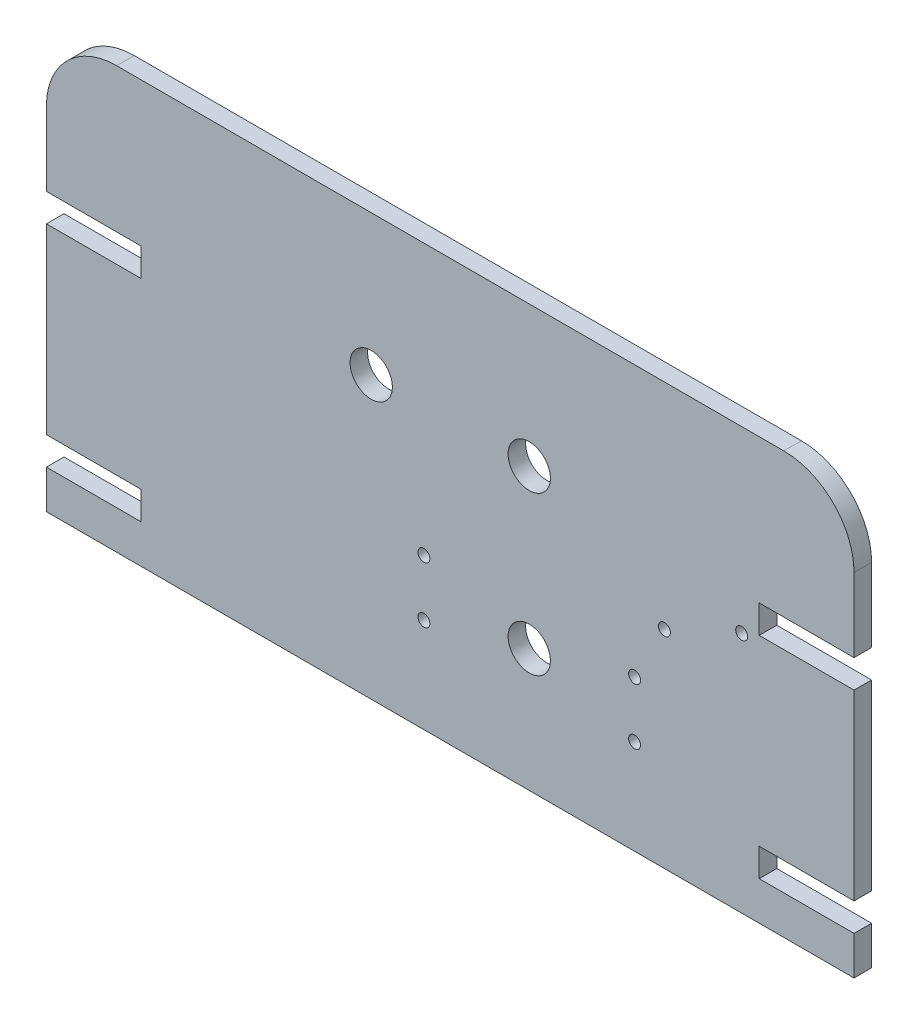
ISO-10303-21;
HEADER;
FILE_DESCRIPTION(('STEP AP214'),'2;1');
FILE_NAME('part.step','',(''),(''),'','','');
FILE_SCHEMA(('AUTOMOTIVE_DESIGN { 1 0 10303 214 1 1 1 1 }'));
ENDSEC;
DATA;
#1=APPLICATION_CONTEXT('core data for automotive mechanical design processes');
#2=APPLICATION_PROTOCOL_DEFINITION('international standard','automotive_design',2000,#1);
#3=PRODUCT_CONTEXT('',#1,'mechanical');
#4=PRODUCT('Part','Part','',(#3));
#5=PRODUCT_RELATED_PRODUCT_CATEGORY('part','',(#4));
#6=PRODUCT_DEFINITION_FORMATION('','',#4);
#7=PRODUCT_DEFINITION_CONTEXT('part definition',#1,'design');
#8=PRODUCT_DEFINITION('design','',#6,#7);
#9=PRODUCT_DEFINITION_SHAPE('','',#8);
#10=(LENGTH_UNIT() NAMED_UNIT(*) SI_UNIT(.MILLI.,.METRE.));
#11=(NAMED_UNIT(*) PLANE_ANGLE_UNIT() SI_UNIT($,.RADIAN.));
#12=(NAMED_UNIT(*) SI_UNIT($,.STERADIAN.) SOLID_ANGLE_UNIT());
#13=UNCERTAINTY_MEASURE_WITH_UNIT(LENGTH_MEASURE(1.E-05),#10,'distance_accuracy_value','');
#14=(GEOMETRIC_REPRESENTATION_CONTEXT(3) GLOBAL_UNCERTAINTY_ASSIGNED_CONTEXT((#13)) GLOBAL_UNIT_ASSIGNED_CONTEXT((#10,
#11,#12)) REPRESENTATION_CONTEXT('',''));
#15=CARTESIAN_POINT('',(0.,0.,0.));
#16=DIRECTION('',(0.,0.,1.));
#17=DIRECTION('',(1.,0.,0.));
#18=AXIS2_PLACEMENT_3D('',#15,#16,#17);
#19=CARTESIAN_POINT('',(115.,-60.,5.));
#20=DIRECTION('',(-1.,0.,0.));
#21=DIRECTION('',(0.,0.,1.));
#22=AXIS2_PLACEMENT_3D('',#19,#20,#21);
#23=PLANE('',#22);
#24=DIRECTION('',(0.,1.,0.));
#25=VECTOR('',#24,1.);
#26=CARTESIAN_POINT('',(115.,-60.,0.));
#27=LINE('',#26,#25);
#28=CARTESIAN_POINT('',(115.,19.0000000007499,0.));
#29=VERTEX_POINT('',#28);
#30=CARTESIAN_POINT('',(115.,40.,0.));
#31=VERTEX_POINT('',#30);
#32=EDGE_CURVE('E240',#29,#31,#27,.T.);
#33=ORIENTED_EDGE('',*,*,#32,.T.);
#34=DIRECTION('',(0.,0.,-1.));
#35=VECTOR('',#34,1.);
#36=CARTESIAN_POINT('',(115.,40.,5.));
#37=LINE('',#36,#35);
#38=CARTESIAN_POINT('',(115.,40.,5.));
#39=VERTEX_POINT('',#38);
#40=EDGE_CURVE('E62',#31,#39,#37,.F.);
#41=ORIENTED_EDGE('',*,*,#40,.T.);
#42=DIRECTION('',(0.,1.,0.));
#43=VECTOR('',#42,1.);
#44=CARTESIAN_POINT('',(115.,-60.,5.));
#45=LINE('',#44,#43);
#46=CARTESIAN_POINT('',(115.,19.0000000007499,5.));
#47=VERTEX_POINT('',#46);
#48=EDGE_CURVE('E251',#47,#39,#45,.T.);
#49=ORIENTED_EDGE('',*,*,#48,.F.);
#50=DIRECTION('',(0.,0.,-1.));
#51=VECTOR('',#50,1.);
#52=CARTESIAN_POINT('',(115.,19.0000000007499,5.001));
#53=LINE('',#52,#51);
#54=EDGE_CURVE('E293',#47,#29,#53,.T.);
#55=ORIENTED_EDGE('',*,*,#54,.T.);
#56=EDGE_LOOP('',(#33,#41,#49,#55));
#57=FACE_BOUND('',#56,.T.);
#58=ADVANCED_FACE('F38',(#57),#23,.F.);
#59=CARTESIAN_POINT('',(115.,-40.9999999999375,0.));
#60=VERTEX_POINT('',#59);
#61=CARTESIAN_POINT('',(115.,11.0000000000625,0.));
#62=VERTEX_POINT('',#61);
#63=EDGE_CURVE('E239',#60,#62,#27,.T.);
#64=ORIENTED_EDGE('',*,*,#63,.T.);
#65=DIRECTION('',(0.,0.,-1.));
#66=VECTOR('',#65,1.);
#67=CARTESIAN_POINT('',(115.,11.0000000000625,5.001));
#68=LINE('',#67,#66);
#69=CARTESIAN_POINT('',(115.,11.0000000000625,5.));
#70=VERTEX_POINT('',#69);
#71=EDGE_CURVE('E387',#70,#62,#68,.T.);
#72=ORIENTED_EDGE('',*,*,#71,.F.);
#73=CARTESIAN_POINT('',(115.,-40.9999999999375,5.));
#74=VERTEX_POINT('',#73);
#75=EDGE_CURVE('E314',#74,#70,#45,.T.);
#76=ORIENTED_EDGE('',*,*,#75,.F.);
#77=DIRECTION('',(0.,0.,-1.));
#78=VECTOR('',#77,1.);
#79=CARTESIAN_POINT('',(115.,-40.9999999999375,5.001));
#80=LINE('',#79,#78);
#81=EDGE_CURVE('E346',#74,#60,#80,.T.);
#82=ORIENTED_EDGE('',*,*,#81,.T.);
#83=EDGE_LOOP('',(#64,#72,#76,#82));
#84=FACE_BOUND('',#83,.T.);
#85=ADVANCED_FACE('F436',(#84),#23,.F.);
#86=CARTESIAN_POINT('',(-115.,-60.,5.));
#87=DIRECTION('',(1.,0.,0.));
#88=DIRECTION('',(0.,0.,-1.));
#89=AXIS2_PLACEMENT_3D('',#86,#87,#88);
#90=PLANE('',#89);
#91=DIRECTION('',(0.,-1.,0.));
#92=VECTOR('',#91,1.);
#93=CARTESIAN_POINT('',(-115.,-60.,5.));
#94=LINE('',#93,#92);
#95=CARTESIAN_POINT('',(-115.,-49.000000000625,5.));
#96=VERTEX_POINT('',#95);
#97=CARTESIAN_POINT('',(-115.,-60.,5.));
#98=VERTEX_POINT('',#97);
#99=EDGE_CURVE('E222',#96,#98,#94,.T.);
#100=ORIENTED_EDGE('',*,*,#99,.F.);
#101=DIRECTION('',(0.,0.,-1.));
#102=VECTOR('',#101,1.);
#103=CARTESIAN_POINT('',(-115.,-49.000000000625,5.001));
#104=LINE('',#103,#102);
#105=CARTESIAN_POINT('',(-115.,-49.000000000625,0.));
#106=VERTEX_POINT('',#105);
#107=EDGE_CURVE('E202',#96,#106,#104,.T.);
#108=ORIENTED_EDGE('',*,*,#107,.T.);
#109=DIRECTION('',(0.,-1.,0.));
#110=VECTOR('',#109,1.);
#111=CARTESIAN_POINT('',(-115.,-60.,0.));
#112=LINE('',#111,#110);
#113=CARTESIAN_POINT('',(-115.,-60.,0.));
#114=VERTEX_POINT('',#113);
#115=EDGE_CURVE('E244',#106,#114,#112,.T.);
#116=ORIENTED_EDGE('',*,*,#115,.T.);
#117=DIRECTION('',(0.,0.,-1.));
#118=VECTOR('',#117,1.);
#119=CARTESIAN_POINT('',(-115.,-60.,5.));
#120=LINE('',#119,#118);
#121=EDGE_CURVE('E255',#98,#114,#120,.T.);
#122=ORIENTED_EDGE('',*,*,#121,.F.);
#123=EDGE_LOOP('',(#100,#108,#116,#122));
#124=FACE_BOUND('',#123,.T.);
#125=ADVANCED_FACE('F327',(#124),#90,.F.);
#126=CARTESIAN_POINT('',(-115.,11.0000000000625,0.));
#127=VERTEX_POINT('',#126);
#128=CARTESIAN_POINT('',(-115.,-40.9999999999375,0.));
#129=VERTEX_POINT('',#128);
#130=EDGE_CURVE('E211',#127,#129,#112,.T.);
#131=ORIENTED_EDGE('',*,*,#130,.T.);
#132=DIRECTION('',(0.,0.,-1.));
#133=VECTOR('',#132,1.);
#134=CARTESIAN_POINT('',(-115.,-40.9999999999375,5.001));
#135=LINE('',#134,#133);
#136=CARTESIAN_POINT('',(-115.,-40.9999999999375,5.));
#137=VERTEX_POINT('',#136);
#138=EDGE_CURVE('E194',#137,#129,#135,.T.);
#139=ORIENTED_EDGE('',*,*,#138,.F.);
#140=CARTESIAN_POINT('',(-115.,11.0000000000625,5.));
#141=VERTEX_POINT('',#140);
#142=EDGE_CURVE('E209',#141,#137,#94,.T.);
#143=ORIENTED_EDGE('',*,*,#142,.F.);
#144=DIRECTION('',(0.,0.,-1.));
#145=VECTOR('',#144,1.);
#146=CARTESIAN_POINT('',(-115.,11.0000000000625,5.001));
#147=LINE('',#146,#145);
#148=EDGE_CURVE('E300',#141,#127,#147,.T.);
#149=ORIENTED_EDGE('',*,*,#148,.T.);
#150=EDGE_LOOP('',(#131,#139,#143,#149));
#151=FACE_BOUND('',#150,.T.);
#152=ADVANCED_FACE('F207',(#151),#90,.F.);
#153=CARTESIAN_POINT('',(115.,-60.,0.));
#154=VERTEX_POINT('',#153);
#155=CARTESIAN_POINT('',(115.,-49.000000000625,0.));
#156=VERTEX_POINT('',#155);
#157=EDGE_CURVE('E234',#154,#156,#27,.T.);
#158=ORIENTED_EDGE('',*,*,#157,.T.);
#159=DIRECTION('',(0.,0.,-1.));
#160=VECTOR('',#159,1.);
#161=CARTESIAN_POINT('',(115.,-49.000000000625,5.001));
#162=LINE('',#161,#160);
#163=CARTESIAN_POINT('',(115.,-49.000000000625,5.));
#164=VERTEX_POINT('',#163);
#165=EDGE_CURVE('E342',#164,#156,#162,.T.);
#166=ORIENTED_EDGE('',*,*,#165,.F.);
#167=CARTESIAN_POINT('',(115.,-60.,5.));
#168=VERTEX_POINT('',#167);
#169=EDGE_CURVE('E286',#168,#164,#45,.T.);
#170=ORIENTED_EDGE('',*,*,#169,.F.);
#171=DIRECTION('',(0.,0.,-1.));
#172=VECTOR('',#171,1.);
#173=CARTESIAN_POINT('',(115.,-60.,5.));
#174=LINE('',#173,#172);
#175=EDGE_CURVE('E233',#168,#154,#174,.T.);
#176=ORIENTED_EDGE('',*,*,#175,.T.);
#177=EDGE_LOOP('',(#158,#166,#170,#176));
#178=FACE_BOUND('',#177,.T.);
#179=ADVANCED_FACE('F341',(#178),#23,.F.);
#180=CARTESIAN_POINT('',(-115.,60.,5.));
#181=DIRECTION('',(0.,-1.,0.));
#182=DIRECTION('',(0.,0.,-1.));
#183=AXIS2_PLACEMENT_3D('',#180,#181,#182);
#184=PLANE('',#183);
#185=DIRECTION('',(-1.,0.,0.));
#186=VECTOR('',#185,1.);
#187=CARTESIAN_POINT('',(-115.,60.,5.));
#188=LINE('',#187,#186);
#189=CARTESIAN_POINT('',(95.,60.,5.));
#190=VERTEX_POINT('',#189);
#191=CARTESIAN_POINT('',(-95.,60.,5.));
#192=VERTEX_POINT('',#191);
#193=EDGE_CURVE('E227',#190,#192,#188,.T.);
#194=ORIENTED_EDGE('',*,*,#193,.F.);
#195=DIRECTION('',(0.,0.,-1.));
#196=VECTOR('',#195,1.);
#197=CARTESIAN_POINT('',(95.,60.,5.));
#198=LINE('',#197,#196);
#199=CARTESIAN_POINT('',(95.,60.,0.));
#200=VERTEX_POINT('',#199);
#201=EDGE_CURVE('E262',#190,#200,#198,.T.);
#202=ORIENTED_EDGE('',*,*,#201,.T.);
#203=DIRECTION('',(-1.,0.,0.));
#204=VECTOR('',#203,1.);
#205=CARTESIAN_POINT('',(-115.,60.,0.));
#206=LINE('',#205,#204);
#207=CARTESIAN_POINT('',(-95.,60.,0.));
#208=VERTEX_POINT('',#207);
#209=EDGE_CURVE('E238',#200,#208,#206,.T.);
#210=ORIENTED_EDGE('',*,*,#209,.T.);
#211=DIRECTION('',(0.,0.,-1.));
#212=VECTOR('',#211,1.);
#213=CARTESIAN_POINT('',(-95.,60.,5.));
#214=LINE('',#213,#212);
#215=EDGE_CURVE('E259',#208,#192,#214,.F.);
#216=ORIENTED_EDGE('',*,*,#215,.T.);
#217=EDGE_LOOP('',(#194,#202,#210,#216));
#218=FACE_BOUND('',#217,.T.);
#219=ADVANCED_FACE('F282',(#218),#184,.F.);
#220=CARTESIAN_POINT('',(-115.,40.,5.));
#221=VERTEX_POINT('',#220);
#222=CARTESIAN_POINT('',(-115.,19.0000000007499,5.));
#223=VERTEX_POINT('',#222);
#224=EDGE_CURVE('E221',#221,#223,#94,.T.);
#225=ORIENTED_EDGE('',*,*,#224,.F.);
#226=DIRECTION('',(0.,0.,-1.));
#227=VECTOR('',#226,1.);
#228=CARTESIAN_POINT('',(-115.,40.,5.));
#229=LINE('',#228,#227);
#230=CARTESIAN_POINT('',(-115.,40.,0.));
#231=VERTEX_POINT('',#230);
#232=EDGE_CURVE('E11',#221,#231,#229,.T.);
#233=ORIENTED_EDGE('',*,*,#232,.T.);
#234=CARTESIAN_POINT('',(-115.,19.0000000007499,0.));
#235=VERTEX_POINT('',#234);
#236=EDGE_CURVE('E245',#231,#235,#112,.T.);
#237=ORIENTED_EDGE('',*,*,#236,.T.);
#238=DIRECTION('',(0.,0.,-1.));
#239=VECTOR('',#238,1.);
#240=CARTESIAN_POINT('',(-115.,19.0000000007499,5.001));
#241=LINE('',#240,#239);
#242=EDGE_CURVE('E310',#223,#235,#241,.T.);
#243=ORIENTED_EDGE('',*,*,#242,.F.);
#244=EDGE_LOOP('',(#225,#233,#237,#243));
#245=FACE_BOUND('',#244,.T.);
#246=ADVANCED_FACE('F423',(#245),#90,.F.);
#247=CARTESIAN_POINT('',(-115.,-60.,5.));
#248=DIRECTION('',(0.,1.,0.));
#249=DIRECTION('',(0.,0.,1.));
#250=AXIS2_PLACEMENT_3D('',#247,#248,#249);
#251=PLANE('',#250);
#252=DIRECTION('',(1.,0.,0.));
#253=VECTOR('',#252,1.);
#254=CARTESIAN_POINT('',(-115.,-60.,0.));
#255=LINE('',#254,#253);
#256=EDGE_CURVE('E248',#114,#154,#255,.T.);
#257=ORIENTED_EDGE('',*,*,#256,.T.);
#258=ORIENTED_EDGE('',*,*,#175,.F.);
#259=DIRECTION('',(1.,0.,0.));
#260=VECTOR('',#259,1.);
#261=CARTESIAN_POINT('',(-115.,-60.,5.));
#262=LINE('',#261,#260);
#263=EDGE_CURVE('E226',#98,#168,#262,.T.);
#264=ORIENTED_EDGE('',*,*,#263,.F.);
#265=ORIENTED_EDGE('',*,*,#121,.T.);
#266=EDGE_LOOP('',(#257,#258,#264,#265));
#267=FACE_BOUND('',#266,.T.);
#268=ADVANCED_FACE('F332',(#267),#251,.F.);
#269=CARTESIAN_POINT('',(0.,0.,5.));
#270=DIRECTION('',(0.,0.,-1.));
#271=DIRECTION('',(-1.,0.,0.));
#272=AXIS2_PLACEMENT_3D('',#269,#270,#271);
#273=PLANE('',#272);
#274=CARTESIAN_POINT('',(61.,-0.999999999937542,5.));
#275=DIRECTION('',(0.,0.,1.));
#276=DIRECTION('',(1.,0.,0.));
#277=AXIS2_PLACEMENT_3D('',#274,#275,#276);
#278=CIRCLE('',#277,1.7);
#279=CARTESIAN_POINT('',(62.7,-0.999999999937542,5.));
#280=VERTEX_POINT('',#279);
#281=EDGE_CURVE('E546',#280,#280,#278,.T.);
#282=ORIENTED_EDGE('',*,*,#281,.F.);
#283=EDGE_LOOP('',(#282));
#284=FACE_BOUND('',#283,.T.);
#285=CARTESIAN_POINT('',(83.,9.00000000006245,5.));
#286=DIRECTION('',(0.,0.,1.));
#287=DIRECTION('',(1.,0.,0.));
#288=AXIS2_PLACEMENT_3D('',#285,#286,#287);
#289=CIRCLE('',#288,1.7);
#290=CARTESIAN_POINT('',(84.7,9.00000000006245,5.));
#291=VERTEX_POINT('',#290);
#292=EDGE_CURVE('E555',#291,#291,#289,.T.);
#293=ORIENTED_EDGE('',*,*,#292,.F.);
#294=EDGE_LOOP('',(#293));
#295=FACE_BOUND('',#294,.T.);
#296=CARTESIAN_POINT('',(-7.49999999999999,-17.,5.));
#297=DIRECTION('',(0.,0.,1.));
#298=DIRECTION('',(1.,0.,0.));
#299=AXIS2_PLACEMENT_3D('',#296,#297,#298);
#300=CIRCLE('',#299,1.69999999999999);
#301=CARTESIAN_POINT('',(-5.80000000000001,-17.,5.));
#302=VERTEX_POINT('',#301);
#303=EDGE_CURVE('E548',#302,#302,#300,.T.);
#304=ORIENTED_EDGE('',*,*,#303,.F.);
#305=EDGE_LOOP('',(#304));
#306=FACE_BOUND('',#305,.T.);
#307=CARTESIAN_POINT('',(52.5,-17.,5.));
#308=DIRECTION('',(0.,0.,1.));
#309=DIRECTION('',(1.,0.,0.));
#310=AXIS2_PLACEMENT_3D('',#307,#308,#309);
#311=CIRCLE('',#310,1.69999999999999);
#312=CARTESIAN_POINT('',(54.2,-17.,5.));
#313=VERTEX_POINT('',#312);
#314=EDGE_CURVE('E568',#313,#313,#311,.T.);
#315=ORIENTED_EDGE('',*,*,#314,.F.);
#316=EDGE_LOOP('',(#315));
#317=FACE_BOUND('',#316,.T.);
#318=CARTESIAN_POINT('',(52.5,-33.,5.));
#319=DIRECTION('',(0.,0.,1.));
#320=DIRECTION('',(1.,0.,0.));
#321=AXIS2_PLACEMENT_3D('',#318,#319,#320);
#322=CIRCLE('',#321,1.69999999999999);
#323=CARTESIAN_POINT('',(54.2,-33.,5.));
#324=VERTEX_POINT('',#323);
#325=EDGE_CURVE('E576',#324,#324,#322,.T.);
#326=ORIENTED_EDGE('',*,*,#325,.F.);
#327=EDGE_LOOP('',(#326));
#328=FACE_BOUND('',#327,.T.);
#329=CARTESIAN_POINT('',(-7.49999999999999,-33.,5.));
#330=DIRECTION('',(0.,0.,1.));
#331=DIRECTION('',(1.,0.,0.));
#332=AXIS2_PLACEMENT_3D('',#329,#330,#331);
#333=CIRCLE('',#332,1.69999999999999);
#334=CARTESIAN_POINT('',(-5.80000000000001,-33.,5.));
#335=VERTEX_POINT('',#334);
#336=EDGE_CURVE('E584',#335,#335,#333,.T.);
#337=ORIENTED_EDGE('',*,*,#336,.F.);
#338=EDGE_LOOP('',(#337));
#339=FACE_BOUND('',#338,.T.);
#340=CARTESIAN_POINT('',(22.5,-25.,5.));
#341=DIRECTION('',(0.,0.,1.));
#342=DIRECTION('',(1.,0.,0.));
#343=AXIS2_PLACEMENT_3D('',#340,#341,#342);
#344=CIRCLE('',#343,6.025);
#345=CARTESIAN_POINT('',(28.525,-25.,5.));
#346=VERTEX_POINT('',#345);
#347=EDGE_CURVE('E602',#346,#346,#344,.T.);
#348=ORIENTED_EDGE('',*,*,#347,.F.);
#349=EDGE_LOOP('',(#348));
#350=FACE_BOUND('',#349,.T.);
#351=CARTESIAN_POINT('',(-22.5,20.,5.));
#352=DIRECTION('',(0.,0.,1.));
#353=DIRECTION('',(1.,0.,0.));
#354=AXIS2_PLACEMENT_3D('',#351,#352,#353);
#355=CIRCLE('',#354,6.025);
#356=CARTESIAN_POINT('',(-16.475,20.,5.));
#357=VERTEX_POINT('',#356);
#358=EDGE_CURVE('E593',#357,#357,#355,.T.);
#359=ORIENTED_EDGE('',*,*,#358,.F.);
#360=EDGE_LOOP('',(#359));
#361=FACE_BOUND('',#360,.T.);
#362=CARTESIAN_POINT('',(22.5,20.,5.));
#363=DIRECTION('',(0.,0.,1.));
#364=DIRECTION('',(1.,0.,0.));
#365=AXIS2_PLACEMENT_3D('',#362,#363,#364);
#366=CIRCLE('',#365,6.025);
#367=CARTESIAN_POINT('',(28.525,20.,5.));
#368=VERTEX_POINT('',#367);
#369=EDGE_CURVE('E361',#368,#368,#366,.T.);
#370=ORIENTED_EDGE('',*,*,#369,.F.);
#371=EDGE_LOOP('',(#370));
#372=FACE_BOUND('',#371,.T.);
#373=ORIENTED_EDGE('',*,*,#48,.T.);
#374=CARTESIAN_POINT('',(95.,40.,5.));
#375=DIRECTION('',(0.,0.,-1.));
#376=DIRECTION('',(-1.,0.,0.));
#377=AXIS2_PLACEMENT_3D('',#374,#375,#376);
#378=CIRCLE('',#377,20.);
#379=EDGE_CURVE('E47',#39,#190,#378,.F.);
#380=ORIENTED_EDGE('',*,*,#379,.T.);
#381=ORIENTED_EDGE('',*,*,#193,.T.);
#382=CARTESIAN_POINT('',(-95.,40.,5.));
#383=DIRECTION('',(0.,0.,-1.));
#384=DIRECTION('',(-1.,0.,0.));
#385=AXIS2_PLACEMENT_3D('',#382,#383,#384);
#386=CIRCLE('',#385,20.);
#387=EDGE_CURVE('E54',#192,#221,#386,.F.);
#388=ORIENTED_EDGE('',*,*,#387,.T.);
#389=ORIENTED_EDGE('',*,*,#224,.T.);
#390=DIRECTION('',(-1.,0.,0.));
#391=VECTOR('',#390,1.);
#392=CARTESIAN_POINT('',(-88.,19.0000000007499,5.));
#393=LINE('',#392,#391);
#394=CARTESIAN_POINT('',(-88.,19.0000000007499,5.));
#395=VERTEX_POINT('',#394);
#396=EDGE_CURVE('E295',#395,#223,#393,.T.);
#397=ORIENTED_EDGE('',*,*,#396,.F.);
#398=DIRECTION('',(0.,1.,0.));
#399=VECTOR('',#398,1.);
#400=CARTESIAN_POINT('',(-88.,11.0000000000625,5.));
#401=LINE('',#400,#399);
#402=CARTESIAN_POINT('',(-88.,11.0000000000625,5.));
#403=VERTEX_POINT('',#402);
#404=EDGE_CURVE('E201',#403,#395,#401,.T.);
#405=ORIENTED_EDGE('',*,*,#404,.F.);
#406=DIRECTION('',(1.,0.,0.));
#407=VECTOR('',#406,1.);
#408=CARTESIAN_POINT('',(-115.,11.0000000000625,5.));
#409=LINE('',#408,#407);
#410=EDGE_CURVE('E219',#141,#403,#409,.T.);
#411=ORIENTED_EDGE('',*,*,#410,.F.);
#412=ORIENTED_EDGE('',*,*,#142,.T.);
#413=DIRECTION('',(-1.,0.,0.));
#414=VECTOR('',#413,1.);
#415=CARTESIAN_POINT('',(-88.,-40.9999999999375,5.));
#416=LINE('',#415,#414);
#417=CARTESIAN_POINT('',(-88.,-40.9999999999375,5.));
#418=VERTEX_POINT('',#417);
#419=EDGE_CURVE('E190',#418,#137,#416,.T.);
#420=ORIENTED_EDGE('',*,*,#419,.F.);
#421=DIRECTION('',(0.,1.,0.));
#422=VECTOR('',#421,1.);
#423=CARTESIAN_POINT('',(-88.,-49.000000000625,5.));
#424=LINE('',#423,#422);
#425=CARTESIAN_POINT('',(-88.,-49.000000000625,5.));
#426=VERTEX_POINT('',#425);
#427=EDGE_CURVE('E615',#426,#418,#424,.T.);
#428=ORIENTED_EDGE('',*,*,#427,.F.);
#429=DIRECTION('',(1.,0.,0.));
#430=VECTOR('',#429,1.);
#431=CARTESIAN_POINT('',(-115.,-49.000000000625,5.));
#432=LINE('',#431,#430);
#433=EDGE_CURVE('E618',#96,#426,#432,.T.);
#434=ORIENTED_EDGE('',*,*,#433,.F.);
#435=ORIENTED_EDGE('',*,*,#99,.T.);
#436=ORIENTED_EDGE('',*,*,#263,.T.);
#437=ORIENTED_EDGE('',*,*,#169,.T.);
#438=DIRECTION('',(1.,0.,0.));
#439=VECTOR('',#438,1.);
#440=CARTESIAN_POINT('',(115.,-49.000000000625,5.));
#441=LINE('',#440,#439);
#442=CARTESIAN_POINT('',(88.,-49.000000000625,5.));
#443=VERTEX_POINT('',#442);
#444=EDGE_CURVE('E383',#443,#164,#441,.T.);
#445=ORIENTED_EDGE('',*,*,#444,.F.);
#446=DIRECTION('',(0.,-1.,0.));
#447=VECTOR('',#446,1.);
#448=CARTESIAN_POINT('',(88.,-49.000000000625,5.));
#449=LINE('',#448,#447);
#450=CARTESIAN_POINT('',(88.,-40.9999999999375,5.));
#451=VERTEX_POINT('',#450);
#452=EDGE_CURVE('E640',#451,#443,#449,.T.);
#453=ORIENTED_EDGE('',*,*,#452,.F.);
#454=DIRECTION('',(-1.,0.,0.));
#455=VECTOR('',#454,1.);
#456=CARTESIAN_POINT('',(88.,-40.9999999999375,5.));
#457=LINE('',#456,#455);
#458=EDGE_CURVE('E644',#74,#451,#457,.T.);
#459=ORIENTED_EDGE('',*,*,#458,.F.);
#460=ORIENTED_EDGE('',*,*,#75,.T.);
#461=DIRECTION('',(1.,0.,0.));
#462=VECTOR('',#461,1.);
#463=CARTESIAN_POINT('',(115.,11.0000000000625,5.));
#464=LINE('',#463,#462);
#465=CARTESIAN_POINT('',(88.,11.0000000000625,5.));
#466=VERTEX_POINT('',#465);
#467=EDGE_CURVE('E357',#466,#70,#464,.T.);
#468=ORIENTED_EDGE('',*,*,#467,.F.);
#469=DIRECTION('',(0.,-1.,0.));
#470=VECTOR('',#469,1.);
#471=CARTESIAN_POINT('',(88.,11.0000000000625,5.));
#472=LINE('',#471,#470);
#473=CARTESIAN_POINT('',(88.,19.0000000007499,5.));
#474=VERTEX_POINT('',#473);
#475=EDGE_CURVE('E360',#474,#466,#472,.T.);
#476=ORIENTED_EDGE('',*,*,#475,.F.);
#477=DIRECTION('',(-1.,0.,0.));
#478=VECTOR('',#477,1.);
#479=CARTESIAN_POINT('',(88.,19.0000000007499,5.));
#480=LINE('',#479,#478);
#481=EDGE_CURVE('E365',#47,#474,#480,.T.);
#482=ORIENTED_EDGE('',*,*,#481,.F.);
#483=EDGE_LOOP('',(#373,#380,#381,#388,#389,#397,#405,#411,#412,#420,#428,#434,#435,#436,#437,
#445,#453,#459,#460,#468,#476,#482));
#484=FACE_BOUND('',#483,.T.);
#485=ADVANCED_FACE('F216',(#284,#295,#306,#317,#328,#339,#350,#361,#372,#484),#273,.F.);
#486=CARTESIAN_POINT('',(0.,0.,0.));
#487=DIRECTION('',(0.,0.,-1.));
#488=DIRECTION('',(-1.,0.,0.));
#489=AXIS2_PLACEMENT_3D('',#486,#487,#488);
#490=PLANE('',#489);
#491=CARTESIAN_POINT('',(61.,-0.999999999937542,0.));
#492=DIRECTION('',(0.,0.,-1.));
#493=DIRECTION('',(-1.,0.,0.));
#494=AXIS2_PLACEMENT_3D('',#491,#492,#493);
#495=CIRCLE('',#494,1.7);
#496=CARTESIAN_POINT('',(59.3,-0.999999999937542,0.));
#497=VERTEX_POINT('',#496);
#498=EDGE_CURVE('E543',#497,#497,#495,.F.);
#499=ORIENTED_EDGE('',*,*,#498,.T.);
#500=EDGE_LOOP('',(#499));
#501=FACE_BOUND('',#500,.T.);
#502=CARTESIAN_POINT('',(83.,9.00000000006245,0.));
#503=DIRECTION('',(0.,0.,-1.));
#504=DIRECTION('',(-1.,0.,0.));
#505=AXIS2_PLACEMENT_3D('',#502,#503,#504);
#506=CIRCLE('',#505,1.7);
#507=CARTESIAN_POINT('',(81.3,9.00000000006245,0.));
#508=VERTEX_POINT('',#507);
#509=EDGE_CURVE('E561',#508,#508,#506,.F.);
#510=ORIENTED_EDGE('',*,*,#509,.T.);
#511=EDGE_LOOP('',(#510));
#512=FACE_BOUND('',#511,.T.);
#513=CARTESIAN_POINT('',(-7.49999999999999,-17.,0.));
#514=DIRECTION('',(0.,0.,1.));
#515=DIRECTION('',(1.,0.,0.));
#516=AXIS2_PLACEMENT_3D('',#513,#514,#515);
#517=CIRCLE('',#516,1.7);
#518=CARTESIAN_POINT('',(-5.79999999999999,-17.,0.));
#519=VERTEX_POINT('',#518);
#520=EDGE_CURVE('E553',#519,#519,#517,.T.);
#521=ORIENTED_EDGE('',*,*,#520,.T.);
#522=EDGE_LOOP('',(#521));
#523=FACE_BOUND('',#522,.T.);
#524=CARTESIAN_POINT('',(52.5,-17.,0.));
#525=DIRECTION('',(0.,0.,1.));
#526=DIRECTION('',(1.,0.,0.));
#527=AXIS2_PLACEMENT_3D('',#524,#525,#526);
#528=CIRCLE('',#527,1.7);
#529=CARTESIAN_POINT('',(54.2,-17.,0.));
#530=VERTEX_POINT('',#529);
#531=EDGE_CURVE('E572',#530,#530,#528,.T.);
#532=ORIENTED_EDGE('',*,*,#531,.T.);
#533=EDGE_LOOP('',(#532));
#534=FACE_BOUND('',#533,.T.);
#535=CARTESIAN_POINT('',(52.5,-33.,0.));
#536=DIRECTION('',(0.,0.,1.));
#537=DIRECTION('',(1.,0.,0.));
#538=AXIS2_PLACEMENT_3D('',#535,#536,#537);
#539=CIRCLE('',#538,1.7);
#540=CARTESIAN_POINT('',(54.2,-33.,0.));
#541=VERTEX_POINT('',#540);
#542=EDGE_CURVE('E580',#541,#541,#539,.T.);
#543=ORIENTED_EDGE('',*,*,#542,.T.);
#544=EDGE_LOOP('',(#543));
#545=FACE_BOUND('',#544,.T.);
#546=CARTESIAN_POINT('',(-7.49999999999999,-33.,0.));
#547=DIRECTION('',(0.,0.,1.));
#548=DIRECTION('',(1.,0.,0.));
#549=AXIS2_PLACEMENT_3D('',#546,#547,#548);
#550=CIRCLE('',#549,1.7);
#551=CARTESIAN_POINT('',(-5.79999999999999,-33.,0.));
#552=VERTEX_POINT('',#551);
#553=EDGE_CURVE('E588',#552,#552,#550,.T.);
#554=ORIENTED_EDGE('',*,*,#553,.T.);
#555=EDGE_LOOP('',(#554));
#556=FACE_BOUND('',#555,.T.);
#557=CARTESIAN_POINT('',(22.5,-25.,0.));
#558=DIRECTION('',(0.,0.,-1.));
#559=DIRECTION('',(-1.,0.,0.));
#560=AXIS2_PLACEMENT_3D('',#557,#558,#559);
#561=CIRCLE('',#560,6.025);
#562=CARTESIAN_POINT('',(16.475,-25.,0.));
#563=VERTEX_POINT('',#562);
#564=EDGE_CURVE('E592',#563,#563,#561,.F.);
#565=ORIENTED_EDGE('',*,*,#564,.T.);
#566=EDGE_LOOP('',(#565));
#567=FACE_BOUND('',#566,.T.);
#568=CARTESIAN_POINT('',(-22.5,20.,0.));
#569=DIRECTION('',(0.,0.,-1.));
#570=DIRECTION('',(-1.,0.,0.));
#571=AXIS2_PLACEMENT_3D('',#568,#569,#570);
#572=CIRCLE('',#571,6.025);
#573=CARTESIAN_POINT('',(-28.525,20.,0.));
#574=VERTEX_POINT('',#573);
#575=EDGE_CURVE('E598',#574,#574,#572,.F.);
#576=ORIENTED_EDGE('',*,*,#575,.T.);
#577=EDGE_LOOP('',(#576));
#578=FACE_BOUND('',#577,.T.);
#579=CARTESIAN_POINT('',(22.5,20.,0.));
#580=DIRECTION('',(0.,0.,-1.));
#581=DIRECTION('',(-1.,0.,0.));
#582=AXIS2_PLACEMENT_3D('',#579,#580,#581);
#583=CIRCLE('',#582,6.025);
#584=CARTESIAN_POINT('',(16.475,20.,0.));
#585=VERTEX_POINT('',#584);
#586=EDGE_CURVE('E597',#585,#585,#583,.F.);
#587=ORIENTED_EDGE('',*,*,#586,.T.);
#588=EDGE_LOOP('',(#587));
#589=FACE_BOUND('',#588,.T.);
#590=ORIENTED_EDGE('',*,*,#209,.F.);
#591=CARTESIAN_POINT('',(95.,40.,0.));
#592=DIRECTION('',(0.,0.,-1.));
#593=DIRECTION('',(-1.,0.,0.));
#594=AXIS2_PLACEMENT_3D('',#591,#592,#593);
#595=CIRCLE('',#594,20.);
#596=EDGE_CURVE('E269',#200,#31,#595,.T.);
#597=ORIENTED_EDGE('',*,*,#596,.T.);
#598=ORIENTED_EDGE('',*,*,#32,.F.);
#599=DIRECTION('',(1.,0.,0.));
#600=VECTOR('',#599,1.);
#601=CARTESIAN_POINT('',(88.,19.0000000007499,0.));
#602=LINE('',#601,#600);
#603=CARTESIAN_POINT('',(88.,19.0000000007499,0.));
#604=VERTEX_POINT('',#603);
#605=EDGE_CURVE('E369',#604,#29,#602,.T.);
#606=ORIENTED_EDGE('',*,*,#605,.F.);
#607=DIRECTION('',(0.,1.,0.));
#608=VECTOR('',#607,1.);
#609=CARTESIAN_POINT('',(88.,11.0000000000625,0.));
#610=LINE('',#609,#608);
#611=CARTESIAN_POINT('',(88.,11.0000000000625,0.));
#612=VERTEX_POINT('',#611);
#613=EDGE_CURVE('E376',#612,#604,#610,.T.);
#614=ORIENTED_EDGE('',*,*,#613,.F.);
#615=DIRECTION('',(-1.,0.,0.));
#616=VECTOR('',#615,1.);
#617=CARTESIAN_POINT('',(115.,11.0000000000625,0.));
#618=LINE('',#617,#616);
#619=EDGE_CURVE('E372',#62,#612,#618,.T.);
#620=ORIENTED_EDGE('',*,*,#619,.F.);
#621=ORIENTED_EDGE('',*,*,#63,.F.);
#622=DIRECTION('',(1.,0.,0.));
#623=VECTOR('',#622,1.);
#624=CARTESIAN_POINT('',(88.,-40.9999999999375,0.));
#625=LINE('',#624,#623);
#626=CARTESIAN_POINT('',(88.,-40.9999999999375,0.));
#627=VERTEX_POINT('',#626);
#628=EDGE_CURVE('E648',#627,#60,#625,.T.);
#629=ORIENTED_EDGE('',*,*,#628,.F.);
#630=DIRECTION('',(0.,1.,0.));
#631=VECTOR('',#630,1.);
#632=CARTESIAN_POINT('',(88.,-49.000000000625,0.));
#633=LINE('',#632,#631);
#634=CARTESIAN_POINT('',(88.,-49.000000000625,0.));
#635=VERTEX_POINT('',#634);
#636=EDGE_CURVE('E353',#635,#627,#633,.T.);
#637=ORIENTED_EDGE('',*,*,#636,.F.);
#638=DIRECTION('',(-1.,0.,0.));
#639=VECTOR('',#638,1.);
#640=CARTESIAN_POINT('',(115.,-49.000000000625,0.));
#641=LINE('',#640,#639);
#642=EDGE_CURVE('E338',#156,#635,#641,.T.);
#643=ORIENTED_EDGE('',*,*,#642,.F.);
#644=ORIENTED_EDGE('',*,*,#157,.F.);
#645=ORIENTED_EDGE('',*,*,#256,.F.);
#646=ORIENTED_EDGE('',*,*,#115,.F.);
#647=DIRECTION('',(-1.,0.,0.));
#648=VECTOR('',#647,1.);
#649=CARTESIAN_POINT('',(-115.,-49.000000000625,0.));
#650=LINE('',#649,#648);
#651=CARTESIAN_POINT('',(-88.,-49.000000000625,0.));
#652=VERTEX_POINT('',#651);
#653=EDGE_CURVE('E213',#652,#106,#650,.T.);
#654=ORIENTED_EDGE('',*,*,#653,.F.);
#655=DIRECTION('',(0.,-1.,0.));
#656=VECTOR('',#655,1.);
#657=CARTESIAN_POINT('',(-88.,-49.000000000625,0.));
#658=LINE('',#657,#656);
#659=CARTESIAN_POINT('',(-88.,-40.9999999999375,0.));
#660=VERTEX_POINT('',#659);
#661=EDGE_CURVE('E625',#660,#652,#658,.T.);
#662=ORIENTED_EDGE('',*,*,#661,.F.);
#663=DIRECTION('',(1.,0.,0.));
#664=VECTOR('',#663,1.);
#665=CARTESIAN_POINT('',(-88.,-40.9999999999375,0.));
#666=LINE('',#665,#664);
#667=EDGE_CURVE('E622',#129,#660,#666,.T.);
#668=ORIENTED_EDGE('',*,*,#667,.F.);
#669=ORIENTED_EDGE('',*,*,#130,.F.);
#670=DIRECTION('',(-1.,0.,0.));
#671=VECTOR('',#670,1.);
#672=CARTESIAN_POINT('',(-115.,11.0000000000625,0.));
#673=LINE('',#672,#671);
#674=CARTESIAN_POINT('',(-88.,11.0000000000625,0.));
#675=VERTEX_POINT('',#674);
#676=EDGE_CURVE('E405',#675,#127,#673,.T.);
#677=ORIENTED_EDGE('',*,*,#676,.F.);
#678=DIRECTION('',(0.,-1.,0.));
#679=VECTOR('',#678,1.);
#680=CARTESIAN_POINT('',(-88.,11.0000000000625,0.));
#681=LINE('',#680,#679);
#682=CARTESIAN_POINT('',(-88.,19.0000000007499,0.));
#683=VERTEX_POINT('',#682);
#684=EDGE_CURVE('E401',#683,#675,#681,.T.);
#685=ORIENTED_EDGE('',*,*,#684,.F.);
#686=DIRECTION('',(1.,0.,0.));
#687=VECTOR('',#686,1.);
#688=CARTESIAN_POINT('',(-88.,19.0000000007499,0.));
#689=LINE('',#688,#687);
#690=EDGE_CURVE('E397',#235,#683,#689,.T.);
#691=ORIENTED_EDGE('',*,*,#690,.F.);
#692=ORIENTED_EDGE('',*,*,#236,.F.);
#693=CARTESIAN_POINT('',(-95.,40.,0.));
#694=DIRECTION('',(0.,0.,-1.));
#695=DIRECTION('',(-1.,0.,0.));
#696=AXIS2_PLACEMENT_3D('',#693,#694,#695);
#697=CIRCLE('',#696,20.);
#698=EDGE_CURVE('E266',#231,#208,#697,.T.);
#699=ORIENTED_EDGE('',*,*,#698,.T.);
#700=EDGE_LOOP('',(#590,#597,#598,#606,#614,#620,#621,#629,#637,#643,#644,#645,#646,#654,#662,
#668,#669,#677,#685,#691,#692,#699));
#701=FACE_BOUND('',#700,.T.);
#702=ADVANCED_FACE('F290',(#501,#512,#523,#534,#545,#556,#567,#578,#589,#701),#490,.T.);
#703=CARTESIAN_POINT('',(-115.,11.0000000000625,5.001));
#704=DIRECTION('',(0.,-1.,0.));
#705=DIRECTION('',(0.,0.,-1.));
#706=AXIS2_PLACEMENT_3D('',#703,#704,#705);
#707=PLANE('',#706);
#708=ORIENTED_EDGE('',*,*,#410,.T.);
#709=DIRECTION('',(0.,0.,-1.));
#710=VECTOR('',#709,1.);
#711=CARTESIAN_POINT('',(-88.,11.0000000000625,5.001));
#712=LINE('',#711,#710);
#713=EDGE_CURVE('E307',#403,#675,#712,.T.);
#714=ORIENTED_EDGE('',*,*,#713,.T.);
#715=ORIENTED_EDGE('',*,*,#676,.T.);
#716=ORIENTED_EDGE('',*,*,#148,.F.);
#717=EDGE_LOOP('',(#708,#714,#715,#716));
#718=FACE_BOUND('',#717,.T.);
#719=ADVANCED_FACE('F421',(#718),#707,.F.);
#720=CARTESIAN_POINT('',(-88.,11.0000000000625,5.001));
#721=DIRECTION('',(1.,0.,0.));
#722=DIRECTION('',(0.,0.,-1.));
#723=AXIS2_PLACEMENT_3D('',#720,#721,#722);
#724=PLANE('',#723);
#725=ORIENTED_EDGE('',*,*,#404,.T.);
#726=DIRECTION('',(0.,0.,-1.));
#727=VECTOR('',#726,1.);
#728=CARTESIAN_POINT('',(-88.,19.0000000007499,5.001));
#729=LINE('',#728,#727);
#730=EDGE_CURVE('E409',#395,#683,#729,.T.);
#731=ORIENTED_EDGE('',*,*,#730,.T.);
#732=ORIENTED_EDGE('',*,*,#684,.T.);
#733=ORIENTED_EDGE('',*,*,#713,.F.);
#734=EDGE_LOOP('',(#725,#731,#732,#733));
#735=FACE_BOUND('',#734,.T.);
#736=ADVANCED_FACE('F419',(#735),#724,.F.);
#737=CARTESIAN_POINT('',(-88.,19.0000000007499,5.001));
#738=DIRECTION('',(0.,1.,0.));
#739=DIRECTION('',(0.,0.,1.));
#740=AXIS2_PLACEMENT_3D('',#737,#738,#739);
#741=PLANE('',#740);
#742=ORIENTED_EDGE('',*,*,#396,.T.);
#743=ORIENTED_EDGE('',*,*,#242,.T.);
#744=ORIENTED_EDGE('',*,*,#690,.T.);
#745=ORIENTED_EDGE('',*,*,#730,.F.);
#746=EDGE_LOOP('',(#742,#743,#744,#745));
#747=FACE_BOUND('',#746,.T.);
#748=ADVANCED_FACE('F414',(#747),#741,.F.);
#749=CARTESIAN_POINT('',(-115.,-49.000000000625,5.001));
#750=DIRECTION('',(0.,-1.,0.));
#751=DIRECTION('',(0.,0.,-1.));
#752=AXIS2_PLACEMENT_3D('',#749,#750,#751);
#753=PLANE('',#752);
#754=ORIENTED_EDGE('',*,*,#433,.T.);
#755=DIRECTION('',(0.,0.,-1.));
#756=VECTOR('',#755,1.);
#757=CARTESIAN_POINT('',(-88.,-49.000000000625,5.001));
#758=LINE('',#757,#756);
#759=EDGE_CURVE('E633',#426,#652,#758,.T.);
#760=ORIENTED_EDGE('',*,*,#759,.T.);
#761=ORIENTED_EDGE('',*,*,#653,.T.);
#762=ORIENTED_EDGE('',*,*,#107,.F.);
#763=EDGE_LOOP('',(#754,#760,#761,#762));
#764=FACE_BOUND('',#763,.T.);
#765=ADVANCED_FACE('F472',(#764),#753,.F.);
#766=CARTESIAN_POINT('',(-88.,-49.000000000625,5.001));
#767=DIRECTION('',(1.,0.,0.));
#768=DIRECTION('',(0.,0.,-1.));
#769=AXIS2_PLACEMENT_3D('',#766,#767,#768);
#770=PLANE('',#769);
#771=ORIENTED_EDGE('',*,*,#427,.T.);
#772=DIRECTION('',(0.,0.,-1.));
#773=VECTOR('',#772,1.);
#774=CARTESIAN_POINT('',(-88.,-40.9999999999375,5.001));
#775=LINE('',#774,#773);
#776=EDGE_CURVE('E196',#418,#660,#775,.T.);
#777=ORIENTED_EDGE('',*,*,#776,.T.);
#778=ORIENTED_EDGE('',*,*,#661,.T.);
#779=ORIENTED_EDGE('',*,*,#759,.F.);
#780=EDGE_LOOP('',(#771,#777,#778,#779));
#781=FACE_BOUND('',#780,.T.);
#782=ADVANCED_FACE('F503',(#781),#770,.F.);
#783=CARTESIAN_POINT('',(-88.,-40.9999999999375,5.001));
#784=DIRECTION('',(0.,1.,0.));
#785=DIRECTION('',(0.,0.,1.));
#786=AXIS2_PLACEMENT_3D('',#783,#784,#785);
#787=PLANE('',#786);
#788=ORIENTED_EDGE('',*,*,#419,.T.);
#789=ORIENTED_EDGE('',*,*,#138,.T.);
#790=ORIENTED_EDGE('',*,*,#667,.T.);
#791=ORIENTED_EDGE('',*,*,#776,.F.);
#792=EDGE_LOOP('',(#788,#789,#790,#791));
#793=FACE_BOUND('',#792,.T.);
#794=ADVANCED_FACE('F192',(#793),#787,.F.);
#795=CARTESIAN_POINT('',(88.,-40.9999999999375,5.001));
#796=DIRECTION('',(0.,1.,0.));
#797=DIRECTION('',(0.,0.,1.));
#798=AXIS2_PLACEMENT_3D('',#795,#796,#797);
#799=PLANE('',#798);
#800=ORIENTED_EDGE('',*,*,#458,.T.);
#801=DIRECTION('',(0.,0.,-1.));
#802=VECTOR('',#801,1.);
#803=CARTESIAN_POINT('',(88.,-40.9999999999375,5.001));
#804=LINE('',#803,#802);
#805=EDGE_CURVE('E350',#451,#627,#804,.T.);
#806=ORIENTED_EDGE('',*,*,#805,.T.);
#807=ORIENTED_EDGE('',*,*,#628,.T.);
#808=ORIENTED_EDGE('',*,*,#81,.F.);
#809=EDGE_LOOP('',(#800,#806,#807,#808));
#810=FACE_BOUND('',#809,.T.);
#811=ADVANCED_FACE('F491',(#810),#799,.F.);
#812=CARTESIAN_POINT('',(88.,-49.000000000625,5.001));
#813=DIRECTION('',(-1.,0.,0.));
#814=DIRECTION('',(0.,0.,1.));
#815=AXIS2_PLACEMENT_3D('',#812,#813,#814);
#816=PLANE('',#815);
#817=ORIENTED_EDGE('',*,*,#452,.T.);
#818=DIRECTION('',(0.,0.,-1.));
#819=VECTOR('',#818,1.);
#820=CARTESIAN_POINT('',(88.,-49.000000000625,5.001));
#821=LINE('',#820,#819);
#822=EDGE_CURVE('E345',#443,#635,#821,.T.);
#823=ORIENTED_EDGE('',*,*,#822,.T.);
#824=ORIENTED_EDGE('',*,*,#636,.T.);
#825=ORIENTED_EDGE('',*,*,#805,.F.);
#826=EDGE_LOOP('',(#817,#823,#824,#825));
#827=FACE_BOUND('',#826,.T.);
#828=ADVANCED_FACE('F494',(#827),#816,.F.);
#829=CARTESIAN_POINT('',(115.,-49.000000000625,5.001));
#830=DIRECTION('',(0.,-1.,0.));
#831=DIRECTION('',(0.,0.,-1.));
#832=AXIS2_PLACEMENT_3D('',#829,#830,#831);
#833=PLANE('',#832);
#834=ORIENTED_EDGE('',*,*,#444,.T.);
#835=ORIENTED_EDGE('',*,*,#165,.T.);
#836=ORIENTED_EDGE('',*,*,#642,.T.);
#837=ORIENTED_EDGE('',*,*,#822,.F.);
#838=EDGE_LOOP('',(#834,#835,#836,#837));
#839=FACE_BOUND('',#838,.T.);
#840=ADVANCED_FACE('F481',(#839),#833,.F.);
#841=CARTESIAN_POINT('',(88.,19.0000000007499,5.001));
#842=DIRECTION('',(0.,1.,0.));
#843=DIRECTION('',(0.,0.,1.));
#844=AXIS2_PLACEMENT_3D('',#841,#842,#843);
#845=PLANE('',#844);
#846=ORIENTED_EDGE('',*,*,#481,.T.);
#847=DIRECTION('',(0.,0.,-1.));
#848=VECTOR('',#847,1.);
#849=CARTESIAN_POINT('',(88.,19.0000000007499,5.001));
#850=LINE('',#849,#848);
#851=EDGE_CURVE('E380',#474,#604,#850,.T.);
#852=ORIENTED_EDGE('',*,*,#851,.T.);
#853=ORIENTED_EDGE('',*,*,#605,.T.);
#854=ORIENTED_EDGE('',*,*,#54,.F.);
#855=EDGE_LOOP('',(#846,#852,#853,#854));
#856=FACE_BOUND('',#855,.T.);
#857=ADVANCED_FACE('F477',(#856),#845,.F.);
#858=CARTESIAN_POINT('',(88.,11.0000000000625,5.001));
#859=DIRECTION('',(-1.,0.,0.));
#860=DIRECTION('',(0.,0.,1.));
#861=AXIS2_PLACEMENT_3D('',#858,#859,#860);
#862=PLANE('',#861);
#863=ORIENTED_EDGE('',*,*,#475,.T.);
#864=DIRECTION('',(0.,0.,-1.));
#865=VECTOR('',#864,1.);
#866=CARTESIAN_POINT('',(88.,11.0000000000625,5.001));
#867=LINE('',#866,#865);
#868=EDGE_CURVE('E384',#466,#612,#867,.T.);
#869=ORIENTED_EDGE('',*,*,#868,.T.);
#870=ORIENTED_EDGE('',*,*,#613,.T.);
#871=ORIENTED_EDGE('',*,*,#851,.F.);
#872=EDGE_LOOP('',(#863,#869,#870,#871));
#873=FACE_BOUND('',#872,.T.);
#874=ADVANCED_FACE('F480',(#873),#862,.F.);
#875=CARTESIAN_POINT('',(115.,11.0000000000625,5.001));
#876=DIRECTION('',(0.,-1.,0.));
#877=DIRECTION('',(0.,0.,-1.));
#878=AXIS2_PLACEMENT_3D('',#875,#876,#877);
#879=PLANE('',#878);
#880=ORIENTED_EDGE('',*,*,#467,.T.);
#881=ORIENTED_EDGE('',*,*,#71,.T.);
#882=ORIENTED_EDGE('',*,*,#619,.T.);
#883=ORIENTED_EDGE('',*,*,#868,.F.);
#884=EDGE_LOOP('',(#880,#881,#882,#883));
#885=FACE_BOUND('',#884,.T.);
#886=ADVANCED_FACE('F483',(#885),#879,.F.);
#887=CARTESIAN_POINT('',(22.5,20.,-0.00100000000000013));
#888=DIRECTION('',(0.,0.,1.));
#889=DIRECTION('',(1.,0.,0.));
#890=AXIS2_PLACEMENT_3D('',#887,#888,#889);
#891=CYLINDRICAL_SURFACE('',#890,6.025);
#892=ORIENTED_EDGE('',*,*,#586,.F.);
#893=EDGE_LOOP('',(#892));
#894=FACE_BOUND('',#893,.T.);
#895=ORIENTED_EDGE('',*,*,#369,.T.);
#896=EDGE_LOOP('',(#895));
#897=FACE_BOUND('',#896,.T.);
#898=ADVANCED_FACE('F486',(#894,#897),#891,.F.);
#899=CARTESIAN_POINT('',(-22.5,20.,-0.00100000000000013));
#900=DIRECTION('',(0.,0.,1.));
#901=DIRECTION('',(1.,0.,0.));
#902=AXIS2_PLACEMENT_3D('',#899,#900,#901);
#903=CYLINDRICAL_SURFACE('',#902,6.025);
#904=ORIENTED_EDGE('',*,*,#575,.F.);
#905=EDGE_LOOP('',(#904));
#906=FACE_BOUND('',#905,.T.);
#907=ORIENTED_EDGE('',*,*,#358,.T.);
#908=EDGE_LOOP('',(#907));
#909=FACE_BOUND('',#908,.T.);
#910=ADVANCED_FACE('F512',(#906,#909),#903,.F.);
#911=CARTESIAN_POINT('',(22.5,-25.,-0.00100000000000013));
#912=DIRECTION('',(0.,0.,1.));
#913=DIRECTION('',(1.,0.,0.));
#914=AXIS2_PLACEMENT_3D('',#911,#912,#913);
#915=CYLINDRICAL_SURFACE('',#914,6.025);
#916=ORIENTED_EDGE('',*,*,#564,.F.);
#917=EDGE_LOOP('',(#916));
#918=FACE_BOUND('',#917,.T.);
#919=ORIENTED_EDGE('',*,*,#347,.T.);
#920=EDGE_LOOP('',(#919));
#921=FACE_BOUND('',#920,.T.);
#922=ADVANCED_FACE('F514',(#918,#921),#915,.F.);
#923=CARTESIAN_POINT('',(-7.49999999999999,-33.,5.));
#924=DIRECTION('',(0.,0.,1.));
#925=DIRECTION('',(1.,0.,0.));
#926=AXIS2_PLACEMENT_3D('',#923,#924,#925);
#927=CYLINDRICAL_SURFACE('',#926,1.69999999999999);
#928=ORIENTED_EDGE('',*,*,#553,.F.);
#929=EDGE_LOOP('',(#928));
#930=FACE_BOUND('',#929,.T.);
#931=ORIENTED_EDGE('',*,*,#336,.T.);
#932=EDGE_LOOP('',(#931));
#933=FACE_BOUND('',#932,.T.);
#934=ADVANCED_FACE('F517',(#930,#933),#927,.F.);
#935=CARTESIAN_POINT('',(52.5,-33.,5.));
#936=DIRECTION('',(0.,0.,1.));
#937=DIRECTION('',(1.,0.,0.));
#938=AXIS2_PLACEMENT_3D('',#935,#936,#937);
#939=CYLINDRICAL_SURFACE('',#938,1.69999999999999);
#940=ORIENTED_EDGE('',*,*,#542,.F.);
#941=EDGE_LOOP('',(#940));
#942=FACE_BOUND('',#941,.T.);
#943=ORIENTED_EDGE('',*,*,#325,.T.);
#944=EDGE_LOOP('',(#943));
#945=FACE_BOUND('',#944,.T.);
#946=ADVANCED_FACE('F524',(#942,#945),#939,.F.);
#947=CARTESIAN_POINT('',(52.5,-17.,5.));
#948=DIRECTION('',(0.,0.,1.));
#949=DIRECTION('',(1.,0.,0.));
#950=AXIS2_PLACEMENT_3D('',#947,#948,#949);
#951=CYLINDRICAL_SURFACE('',#950,1.69999999999999);
#952=ORIENTED_EDGE('',*,*,#531,.F.);
#953=EDGE_LOOP('',(#952));
#954=FACE_BOUND('',#953,.T.);
#955=ORIENTED_EDGE('',*,*,#314,.T.);
#956=EDGE_LOOP('',(#955));
#957=FACE_BOUND('',#956,.T.);
#958=ADVANCED_FACE('F528',(#954,#957),#951,.F.);
#959=CARTESIAN_POINT('',(-7.49999999999999,-17.,5.));
#960=DIRECTION('',(0.,0.,1.));
#961=DIRECTION('',(1.,0.,0.));
#962=AXIS2_PLACEMENT_3D('',#959,#960,#961);
#963=CYLINDRICAL_SURFACE('',#962,1.69999999999999);
#964=ORIENTED_EDGE('',*,*,#520,.F.);
#965=EDGE_LOOP('',(#964));
#966=FACE_BOUND('',#965,.T.);
#967=ORIENTED_EDGE('',*,*,#303,.T.);
#968=EDGE_LOOP('',(#967));
#969=FACE_BOUND('',#968,.T.);
#970=ADVANCED_FACE('F434',(#966,#969),#963,.F.);
#971=CARTESIAN_POINT('',(95.,40.,5.));
#972=DIRECTION('',(0.,0.,-1.));
#973=DIRECTION('',(-1.,0.,0.));
#974=AXIS2_PLACEMENT_3D('',#971,#972,#973);
#975=CYLINDRICAL_SURFACE('',#974,20.);
#976=ORIENTED_EDGE('',*,*,#379,.F.);
#977=ORIENTED_EDGE('',*,*,#40,.F.);
#978=ORIENTED_EDGE('',*,*,#596,.F.);
#979=ORIENTED_EDGE('',*,*,#201,.F.);
#980=EDGE_LOOP('',(#976,#977,#978,#979));
#981=FACE_BOUND('',#980,.T.);
#982=ADVANCED_FACE('F287',(#981),#975,.T.);
#983=CARTESIAN_POINT('',(-95.,40.,5.));
#984=DIRECTION('',(0.,0.,-1.));
#985=DIRECTION('',(-1.,0.,0.));
#986=AXIS2_PLACEMENT_3D('',#983,#984,#985);
#987=CYLINDRICAL_SURFACE('',#986,20.);
#988=ORIENTED_EDGE('',*,*,#387,.F.);
#989=ORIENTED_EDGE('',*,*,#215,.F.);
#990=ORIENTED_EDGE('',*,*,#698,.F.);
#991=ORIENTED_EDGE('',*,*,#232,.F.);
#992=EDGE_LOOP('',(#988,#989,#990,#991));
#993=FACE_BOUND('',#992,.T.);
#994=ADVANCED_FACE('F40',(#993),#987,.T.);
#995=CARTESIAN_POINT('',(83.,9.00000000006245,-0.00100000000000013));
#996=DIRECTION('',(0.,0.,1.));
#997=DIRECTION('',(1.,0.,0.));
#998=AXIS2_PLACEMENT_3D('',#995,#996,#997);
#999=CYLINDRICAL_SURFACE('',#998,1.7);
#1000=ORIENTED_EDGE('',*,*,#509,.F.);
#1001=EDGE_LOOP('',(#1000));
#1002=FACE_BOUND('',#1001,.T.);
#1003=ORIENTED_EDGE('',*,*,#292,.T.);
#1004=EDGE_LOOP('',(#1003));
#1005=FACE_BOUND('',#1004,.T.);
#1006=ADVANCED_FACE('F426',(#1002,#1005),#999,.F.);
#1007=CARTESIAN_POINT('',(61.,-0.999999999937542,-0.00100000000000013));
#1008=DIRECTION('',(0.,0.,1.));
#1009=DIRECTION('',(1.,0.,0.));
#1010=AXIS2_PLACEMENT_3D('',#1007,#1008,#1009);
#1011=CYLINDRICAL_SURFACE('',#1010,1.7);
#1012=ORIENTED_EDGE('',*,*,#498,.F.);
#1013=EDGE_LOOP('',(#1012));
#1014=FACE_BOUND('',#1013,.T.);
#1015=ORIENTED_EDGE('',*,*,#281,.T.);
#1016=EDGE_LOOP('',(#1015));
#1017=FACE_BOUND('',#1016,.T.);
#1018=ADVANCED_FACE('F431',(#1014,#1017),#1011,.F.);
#1019=CLOSED_SHELL('',(#58,#85,#125,#152,#179,#219,#246,#268,#485,#702,#719,#736,#748,#765,#782,
#794,#811,#828,#840,#857,#874,#886,#898,#910,#922,#934,#946,#958,#970,#982,#994,#1006,#1018));
#1020=MANIFOLD_SOLID_BREP('B2',#1019);
#1021=ADVANCED_BREP_SHAPE_REPRESENTATION('',(#18,#1020),#14);
#1022=SHAPE_DEFINITION_REPRESENTATION(#9,#1021);
ENDSEC;
END-ISO-10303-21;
